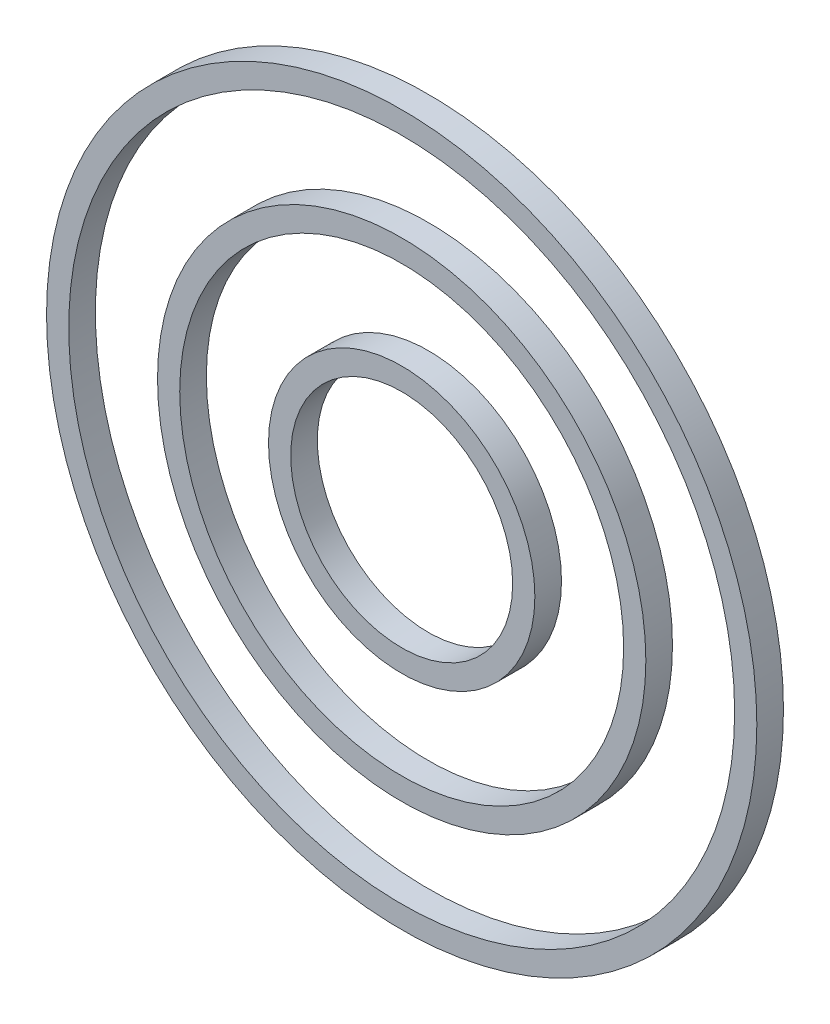
ISO-10303-21;
HEADER;
FILE_DESCRIPTION(('STEP AP214'),'2;1');
FILE_NAME('part.step','',(''),(''),'','','');
FILE_SCHEMA(('AUTOMOTIVE_DESIGN { 1 0 10303 214 1 1 1 1 }'));
ENDSEC;
DATA;
#1=APPLICATION_CONTEXT('core data for automotive mechanical design processes');
#2=APPLICATION_PROTOCOL_DEFINITION('international standard','automotive_design',2000,#1);
#3=PRODUCT_CONTEXT('',#1,'mechanical');
#4=PRODUCT('Part','Part','',(#3));
#5=PRODUCT_RELATED_PRODUCT_CATEGORY('part','',(#4));
#6=PRODUCT_DEFINITION_FORMATION('','',#4);
#7=PRODUCT_DEFINITION_CONTEXT('part definition',#1,'design');
#8=PRODUCT_DEFINITION('design','',#6,#7);
#9=PRODUCT_DEFINITION_SHAPE('','',#8);
#10=(LENGTH_UNIT() NAMED_UNIT(*) SI_UNIT(.MILLI.,.METRE.));
#11=(NAMED_UNIT(*) PLANE_ANGLE_UNIT() SI_UNIT($,.RADIAN.));
#12=(NAMED_UNIT(*) SI_UNIT($,.STERADIAN.) SOLID_ANGLE_UNIT());
#13=UNCERTAINTY_MEASURE_WITH_UNIT(LENGTH_MEASURE(1.E-05),#10,'distance_accuracy_value','');
#14=(GEOMETRIC_REPRESENTATION_CONTEXT(3) GLOBAL_UNCERTAINTY_ASSIGNED_CONTEXT((#13)) GLOBAL_UNIT_ASSIGNED_CONTEXT((#10,
#11,#12)) REPRESENTATION_CONTEXT('',''));
#15=CARTESIAN_POINT('',(0.,0.,0.));
#16=DIRECTION('',(0.,0.,1.));
#17=DIRECTION('',(1.,0.,0.));
#18=AXIS2_PLACEMENT_3D('',#15,#16,#17);
#19=CARTESIAN_POINT('',(0.,0.,3.));
#20=DIRECTION('',(0.,0.,-1.));
#21=DIRECTION('',(-1.,0.,0.));
#22=AXIS2_PLACEMENT_3D('',#19,#20,#21);
#23=CYLINDRICAL_SURFACE('',#22,12.5);
#24=CARTESIAN_POINT('',(0.,0.,3.));
#25=DIRECTION('',(0.,0.,1.));
#26=DIRECTION('',(1.,0.,0.));
#27=AXIS2_PLACEMENT_3D('',#24,#25,#26);
#28=CIRCLE('',#27,12.5);
#29=CARTESIAN_POINT('',(12.5,0.,3.));
#30=VERTEX_POINT('',#29);
#31=EDGE_CURVE('E65',#30,#30,#28,.T.);
#32=ORIENTED_EDGE('',*,*,#31,.T.);
#33=EDGE_LOOP('',(#32));
#34=FACE_BOUND('',#33,.T.);
#35=CARTESIAN_POINT('',(0.,0.,0.));
#36=DIRECTION('',(0.,0.,1.));
#37=DIRECTION('',(1.,0.,0.));
#38=AXIS2_PLACEMENT_3D('',#35,#36,#37);
#39=CIRCLE('',#38,12.5);
#40=CARTESIAN_POINT('',(12.5,0.,0.));
#41=VERTEX_POINT('',#40);
#42=EDGE_CURVE('E71',#41,#41,#39,.T.);
#43=ORIENTED_EDGE('',*,*,#42,.F.);
#44=EDGE_LOOP('',(#43));
#45=FACE_BOUND('',#44,.T.);
#46=ADVANCED_FACE('F58',(#34,#45),#23,.F.);
#47=CARTESIAN_POINT('',(0.,0.,3.));
#48=DIRECTION('',(0.,0.,-1.));
#49=DIRECTION('',(-1.,0.,0.));
#50=AXIS2_PLACEMENT_3D('',#47,#48,#49);
#51=CYLINDRICAL_SURFACE('',#50,15.);
#52=CARTESIAN_POINT('',(0.,0.,3.));
#53=DIRECTION('',(0.,0.,1.));
#54=DIRECTION('',(1.,0.,0.));
#55=AXIS2_PLACEMENT_3D('',#52,#53,#54);
#56=CIRCLE('',#55,15.);
#57=CARTESIAN_POINT('',(15.,0.,3.));
#58=VERTEX_POINT('',#57);
#59=EDGE_CURVE('E12',#58,#58,#56,.T.);
#60=ORIENTED_EDGE('',*,*,#59,.F.);
#61=EDGE_LOOP('',(#60));
#62=FACE_BOUND('',#61,.T.);
#63=CARTESIAN_POINT('',(0.,0.,0.));
#64=DIRECTION('',(0.,0.,1.));
#65=DIRECTION('',(1.,0.,0.));
#66=AXIS2_PLACEMENT_3D('',#63,#64,#65);
#67=CIRCLE('',#66,15.);
#68=CARTESIAN_POINT('',(15.,0.,0.));
#69=VERTEX_POINT('',#68);
#70=EDGE_CURVE('E61',#69,#69,#67,.T.);
#71=ORIENTED_EDGE('',*,*,#70,.T.);
#72=EDGE_LOOP('',(#71));
#73=FACE_BOUND('',#72,.T.);
#74=ADVANCED_FACE('F78',(#62,#73),#51,.T.);
#75=CARTESIAN_POINT('',(0.,0.,3.));
#76=DIRECTION('',(0.,0.,1.));
#77=DIRECTION('',(1.,0.,0.));
#78=AXIS2_PLACEMENT_3D('',#75,#76,#77);
#79=PLANE('',#78);
#80=ORIENTED_EDGE('',*,*,#31,.F.);
#81=EDGE_LOOP('',(#80));
#82=FACE_BOUND('',#81,.T.);
#83=ORIENTED_EDGE('',*,*,#59,.T.);
#84=EDGE_LOOP('',(#83));
#85=FACE_BOUND('',#84,.T.);
#86=ADVANCED_FACE('F82',(#82,#85),#79,.T.);
#87=CARTESIAN_POINT('',(0.,0.,0.));
#88=DIRECTION('',(0.,0.,1.));
#89=DIRECTION('',(1.,0.,0.));
#90=AXIS2_PLACEMENT_3D('',#87,#88,#89);
#91=PLANE('',#90);
#92=ORIENTED_EDGE('',*,*,#42,.T.);
#93=EDGE_LOOP('',(#92));
#94=FACE_BOUND('',#93,.T.);
#95=ORIENTED_EDGE('',*,*,#70,.F.);
#96=EDGE_LOOP('',(#95));
#97=FACE_BOUND('',#96,.T.);
#98=ADVANCED_FACE('F80',(#94,#97),#91,.F.);
#99=CLOSED_SHELL('',(#46,#74,#86,#98));
#100=MANIFOLD_SOLID_BREP('B2',#99);
#101=CARTESIAN_POINT('',(0.,0.,3.));
#102=DIRECTION('',(0.,0.,-1.));
#103=DIRECTION('',(-1.,0.,0.));
#104=AXIS2_PLACEMENT_3D('',#101,#102,#103);
#105=CYLINDRICAL_SURFACE('',#104,25.);
#106=CARTESIAN_POINT('',(0.,0.,3.));
#107=DIRECTION('',(0.,0.,1.));
#108=DIRECTION('',(1.,0.,0.));
#109=AXIS2_PLACEMENT_3D('',#106,#107,#108);
#110=CIRCLE('',#109,25.);
#111=CARTESIAN_POINT('',(25.,0.,3.));
#112=VERTEX_POINT('',#111);
#113=EDGE_CURVE('E134',#112,#112,#110,.T.);
#114=ORIENTED_EDGE('',*,*,#113,.T.);
#115=EDGE_LOOP('',(#114));
#116=FACE_BOUND('',#115,.T.);
#117=CARTESIAN_POINT('',(0.,0.,0.));
#118=DIRECTION('',(0.,0.,1.));
#119=DIRECTION('',(1.,0.,0.));
#120=AXIS2_PLACEMENT_3D('',#117,#118,#119);
#121=CIRCLE('',#120,25.);
#122=CARTESIAN_POINT('',(25.,0.,0.));
#123=VERTEX_POINT('',#122);
#124=EDGE_CURVE('E140',#123,#123,#121,.T.);
#125=ORIENTED_EDGE('',*,*,#124,.F.);
#126=EDGE_LOOP('',(#125));
#127=FACE_BOUND('',#126,.T.);
#128=ADVANCED_FACE('F127',(#116,#127),#105,.F.);
#129=CARTESIAN_POINT('',(0.,0.,3.));
#130=DIRECTION('',(0.,0.,-1.));
#131=DIRECTION('',(-1.,0.,0.));
#132=AXIS2_PLACEMENT_3D('',#129,#130,#131);
#133=CYLINDRICAL_SURFACE('',#132,27.5);
#134=CARTESIAN_POINT('',(0.,0.,3.));
#135=DIRECTION('',(0.,0.,1.));
#136=DIRECTION('',(1.,0.,0.));
#137=AXIS2_PLACEMENT_3D('',#134,#135,#136);
#138=CIRCLE('',#137,27.5);
#139=CARTESIAN_POINT('',(27.5,0.,3.));
#140=VERTEX_POINT('',#139);
#141=EDGE_CURVE('E57',#140,#140,#138,.T.);
#142=ORIENTED_EDGE('',*,*,#141,.F.);
#143=EDGE_LOOP('',(#142));
#144=FACE_BOUND('',#143,.T.);
#145=CARTESIAN_POINT('',(0.,0.,0.));
#146=DIRECTION('',(0.,0.,1.));
#147=DIRECTION('',(1.,0.,0.));
#148=AXIS2_PLACEMENT_3D('',#145,#146,#147);
#149=CIRCLE('',#148,27.5);
#150=CARTESIAN_POINT('',(27.5,0.,0.));
#151=VERTEX_POINT('',#150);
#152=EDGE_CURVE('E130',#151,#151,#149,.T.);
#153=ORIENTED_EDGE('',*,*,#152,.T.);
#154=EDGE_LOOP('',(#153));
#155=FACE_BOUND('',#154,.T.);
#156=ADVANCED_FACE('F147',(#144,#155),#133,.T.);
#157=CARTESIAN_POINT('',(0.,0.,3.));
#158=DIRECTION('',(0.,0.,1.));
#159=DIRECTION('',(1.,0.,0.));
#160=AXIS2_PLACEMENT_3D('',#157,#158,#159);
#161=PLANE('',#160);
#162=ORIENTED_EDGE('',*,*,#113,.F.);
#163=EDGE_LOOP('',(#162));
#164=FACE_BOUND('',#163,.T.);
#165=ORIENTED_EDGE('',*,*,#141,.T.);
#166=EDGE_LOOP('',(#165));
#167=FACE_BOUND('',#166,.T.);
#168=ADVANCED_FACE('F151',(#164,#167),#161,.T.);
#169=CARTESIAN_POINT('',(0.,0.,0.));
#170=DIRECTION('',(0.,0.,1.));
#171=DIRECTION('',(1.,0.,0.));
#172=AXIS2_PLACEMENT_3D('',#169,#170,#171);
#173=PLANE('',#172);
#174=ORIENTED_EDGE('',*,*,#124,.T.);
#175=EDGE_LOOP('',(#174));
#176=FACE_BOUND('',#175,.T.);
#177=ORIENTED_EDGE('',*,*,#152,.F.);
#178=EDGE_LOOP('',(#177));
#179=FACE_BOUND('',#178,.T.);
#180=ADVANCED_FACE('F149',(#176,#179),#173,.F.);
#181=CLOSED_SHELL('',(#128,#156,#168,#180));
#182=MANIFOLD_SOLID_BREP('B7',#181);
#183=CARTESIAN_POINT('',(0.,0.,3.));
#184=DIRECTION('',(0.,0.,-1.));
#185=DIRECTION('',(-1.,0.,0.));
#186=AXIS2_PLACEMENT_3D('',#183,#184,#185);
#187=CYLINDRICAL_SURFACE('',#186,37.5);
#188=CARTESIAN_POINT('',(0.,0.,3.));
#189=DIRECTION('',(0.,0.,1.));
#190=DIRECTION('',(1.,0.,0.));
#191=AXIS2_PLACEMENT_3D('',#188,#189,#190);
#192=CIRCLE('',#191,37.5);
#193=CARTESIAN_POINT('',(37.5,0.,3.));
#194=VERTEX_POINT('',#193);
#195=EDGE_CURVE('E196',#194,#194,#192,.T.);
#196=ORIENTED_EDGE('',*,*,#195,.T.);
#197=EDGE_LOOP('',(#196));
#198=FACE_BOUND('',#197,.T.);
#199=CARTESIAN_POINT('',(0.,0.,0.));
#200=DIRECTION('',(0.,0.,1.));
#201=DIRECTION('',(1.,0.,0.));
#202=AXIS2_PLACEMENT_3D('',#199,#200,#201);
#203=CIRCLE('',#202,37.5);
#204=CARTESIAN_POINT('',(37.5,0.,0.));
#205=VERTEX_POINT('',#204);
#206=EDGE_CURVE('E202',#205,#205,#203,.T.);
#207=ORIENTED_EDGE('',*,*,#206,.F.);
#208=EDGE_LOOP('',(#207));
#209=FACE_BOUND('',#208,.T.);
#210=ADVANCED_FACE('F189',(#198,#209),#187,.F.);
#211=CARTESIAN_POINT('',(0.,0.,3.));
#212=DIRECTION('',(0.,0.,-1.));
#213=DIRECTION('',(-1.,0.,0.));
#214=AXIS2_PLACEMENT_3D('',#211,#212,#213);
#215=CYLINDRICAL_SURFACE('',#214,40.);
#216=CARTESIAN_POINT('',(0.,0.,3.));
#217=DIRECTION('',(0.,0.,1.));
#218=DIRECTION('',(1.,0.,0.));
#219=AXIS2_PLACEMENT_3D('',#216,#217,#218);
#220=CIRCLE('',#219,40.);
#221=CARTESIAN_POINT('',(40.,0.,3.));
#222=VERTEX_POINT('',#221);
#223=EDGE_CURVE('E126',#222,#222,#220,.T.);
#224=ORIENTED_EDGE('',*,*,#223,.F.);
#225=EDGE_LOOP('',(#224));
#226=FACE_BOUND('',#225,.T.);
#227=CARTESIAN_POINT('',(0.,0.,0.));
#228=DIRECTION('',(0.,0.,1.));
#229=DIRECTION('',(1.,0.,0.));
#230=AXIS2_PLACEMENT_3D('',#227,#228,#229);
#231=CIRCLE('',#230,40.);
#232=CARTESIAN_POINT('',(40.,0.,0.));
#233=VERTEX_POINT('',#232);
#234=EDGE_CURVE('E192',#233,#233,#231,.T.);
#235=ORIENTED_EDGE('',*,*,#234,.T.);
#236=EDGE_LOOP('',(#235));
#237=FACE_BOUND('',#236,.T.);
#238=ADVANCED_FACE('F209',(#226,#237),#215,.T.);
#239=CARTESIAN_POINT('',(0.,0.,3.));
#240=DIRECTION('',(0.,0.,1.));
#241=DIRECTION('',(1.,0.,0.));
#242=AXIS2_PLACEMENT_3D('',#239,#240,#241);
#243=PLANE('',#242);
#244=ORIENTED_EDGE('',*,*,#195,.F.);
#245=EDGE_LOOP('',(#244));
#246=FACE_BOUND('',#245,.T.);
#247=ORIENTED_EDGE('',*,*,#223,.T.);
#248=EDGE_LOOP('',(#247));
#249=FACE_BOUND('',#248,.T.);
#250=ADVANCED_FACE('F213',(#246,#249),#243,.T.);
#251=CARTESIAN_POINT('',(0.,0.,0.));
#252=DIRECTION('',(0.,0.,1.));
#253=DIRECTION('',(1.,0.,0.));
#254=AXIS2_PLACEMENT_3D('',#251,#252,#253);
#255=PLANE('',#254);
#256=ORIENTED_EDGE('',*,*,#206,.T.);
#257=EDGE_LOOP('',(#256));
#258=FACE_BOUND('',#257,.T.);
#259=ORIENTED_EDGE('',*,*,#234,.F.);
#260=EDGE_LOOP('',(#259));
#261=FACE_BOUND('',#260,.T.);
#262=ADVANCED_FACE('F211',(#258,#261),#255,.F.);
#263=CLOSED_SHELL('',(#210,#238,#250,#262));
#264=MANIFOLD_SOLID_BREP('B52',#263);
#265=ADVANCED_BREP_SHAPE_REPRESENTATION('',(#18,#100,#182,#264),#14);
#266=SHAPE_DEFINITION_REPRESENTATION(#9,#265);
ENDSEC;
END-ISO-10303-21;
